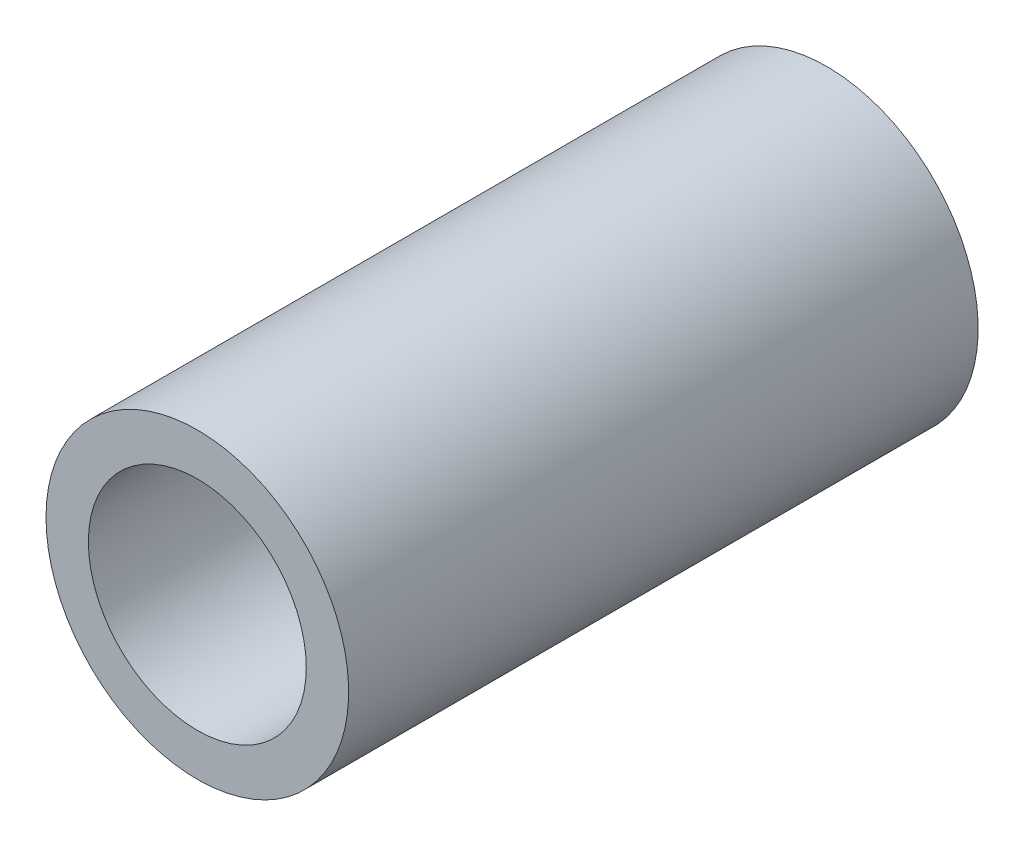
ISO-10303-21;
HEADER;
FILE_DESCRIPTION(('STEP AP214'),'2;1');
FILE_NAME('part.step','',(''),(''),'','','');
FILE_SCHEMA(('AUTOMOTIVE_DESIGN { 1 0 10303 214 1 1 1 1 }'));
ENDSEC;
DATA;
#1=APPLICATION_CONTEXT('core data for automotive mechanical design processes');
#2=APPLICATION_PROTOCOL_DEFINITION('international standard','automotive_design',2000,#1);
#3=PRODUCT_CONTEXT('',#1,'mechanical');
#4=PRODUCT('Part','Part','',(#3));
#5=PRODUCT_RELATED_PRODUCT_CATEGORY('part','',(#4));
#6=PRODUCT_DEFINITION_FORMATION('','',#4);
#7=PRODUCT_DEFINITION_CONTEXT('part definition',#1,'design');
#8=PRODUCT_DEFINITION('design','',#6,#7);
#9=PRODUCT_DEFINITION_SHAPE('','',#8);
#10=(LENGTH_UNIT() NAMED_UNIT(*) SI_UNIT(.MILLI.,.METRE.));
#11=(NAMED_UNIT(*) PLANE_ANGLE_UNIT() SI_UNIT($,.RADIAN.));
#12=(NAMED_UNIT(*) SI_UNIT($,.STERADIAN.) SOLID_ANGLE_UNIT());
#13=UNCERTAINTY_MEASURE_WITH_UNIT(LENGTH_MEASURE(1.E-05),#10,'distance_accuracy_value','');
#14=(GEOMETRIC_REPRESENTATION_CONTEXT(3) GLOBAL_UNCERTAINTY_ASSIGNED_CONTEXT((#13)) GLOBAL_UNIT_ASSIGNED_CONTEXT((#10,
#11,#12)) REPRESENTATION_CONTEXT('',''));
#15=CARTESIAN_POINT('',(0.,0.,0.));
#16=DIRECTION('',(0.,0.,1.));
#17=DIRECTION('',(1.,0.,0.));
#18=AXIS2_PLACEMENT_3D('',#15,#16,#17);
#19=CARTESIAN_POINT('',(0.,0.,26.));
#20=DIRECTION('',(0.,0.,1.));
#21=DIRECTION('',(1.,0.,0.));
#22=AXIS2_PLACEMENT_3D('',#19,#20,#21);
#23=PLANE('',#22);
#24=CARTESIAN_POINT('',(0.,0.,26.));
#25=DIRECTION('',(0.,0.,1.));
#26=DIRECTION('',(1.,0.,0.));
#27=AXIS2_PLACEMENT_3D('',#24,#25,#26);
#28=CIRCLE('',#27,12.5);
#29=CARTESIAN_POINT('',(-12.5,0.,26.));
#30=VERTEX_POINT('',#29);
#31=EDGE_CURVE('E10',#30,#30,#28,.T.);
#32=ORIENTED_EDGE('',*,*,#31,.T.);
#33=EDGE_LOOP('',(#32));
#34=FACE_BOUND('',#33,.T.);
#35=CARTESIAN_POINT('',(0.,0.,26.));
#36=DIRECTION('',(0.,0.,1.));
#37=DIRECTION('',(1.,0.,0.));
#38=AXIS2_PLACEMENT_3D('',#35,#36,#37);
#39=CIRCLE('',#38,9.);
#40=CARTESIAN_POINT('',(-9.,0.,26.));
#41=VERTEX_POINT('',#40);
#42=EDGE_CURVE('E50',#41,#41,#39,.T.);
#43=ORIENTED_EDGE('',*,*,#42,.F.);
#44=EDGE_LOOP('',(#43));
#45=FACE_BOUND('',#44,.T.);
#46=ADVANCED_FACE('F37',(#34,#45),#23,.T.);
#47=CARTESIAN_POINT('',(0.,0.,-26.));
#48=DIRECTION('',(0.,0.,1.));
#49=DIRECTION('',(1.,0.,0.));
#50=AXIS2_PLACEMENT_3D('',#47,#48,#49);
#51=PLANE('',#50);
#52=CARTESIAN_POINT('',(0.,0.,-26.));
#53=DIRECTION('',(0.,0.,1.));
#54=DIRECTION('',(1.,0.,0.));
#55=AXIS2_PLACEMENT_3D('',#52,#53,#54);
#56=CIRCLE('',#55,12.5);
#57=CARTESIAN_POINT('',(-12.5,0.,-26.));
#58=VERTEX_POINT('',#57);
#59=EDGE_CURVE('E41',#58,#58,#56,.T.);
#60=ORIENTED_EDGE('',*,*,#59,.F.);
#61=EDGE_LOOP('',(#60));
#62=FACE_BOUND('',#61,.T.);
#63=CARTESIAN_POINT('',(0.,0.,-26.));
#64=DIRECTION('',(0.,0.,1.));
#65=DIRECTION('',(1.,0.,0.));
#66=AXIS2_PLACEMENT_3D('',#63,#64,#65);
#67=CIRCLE('',#66,9.);
#68=CARTESIAN_POINT('',(-9.,0.,-26.));
#69=VERTEX_POINT('',#68);
#70=EDGE_CURVE('E52',#69,#69,#67,.T.);
#71=ORIENTED_EDGE('',*,*,#70,.T.);
#72=EDGE_LOOP('',(#71));
#73=FACE_BOUND('',#72,.T.);
#74=ADVANCED_FACE('F64',(#62,#73),#51,.F.);
#75=CARTESIAN_POINT('',(0.,0.,26.));
#76=DIRECTION('',(0.,0.,-1.));
#77=DIRECTION('',(-1.,0.,0.));
#78=AXIS2_PLACEMENT_3D('',#75,#76,#77);
#79=CYLINDRICAL_SURFACE('',#78,12.5);
#80=CARTESIAN_POINT('',(-12.5,0.,26.));
#81=CARTESIAN_POINT('',(-12.5,0.,25.4583333333333));
#82=CARTESIAN_POINT('',(-12.5,0.,24.9166666666667));
#83=CARTESIAN_POINT('',(-12.5,0.,23.8333333333333));
#84=CARTESIAN_POINT('',(-12.5,0.,23.2916666666667));
#85=CARTESIAN_POINT('',(-12.5,0.,22.2083333333333));
#86=CARTESIAN_POINT('',(-12.5,0.,21.6666666666667));
#87=CARTESIAN_POINT('',(-12.5,0.,20.5833333333333));
#88=CARTESIAN_POINT('',(-12.5,0.,20.0416666666667));
#89=CARTESIAN_POINT('',(-12.5,0.,18.9583333333333));
#90=CARTESIAN_POINT('',(-12.5,0.,18.4166666666667));
#91=CARTESIAN_POINT('',(-12.5,0.,17.3333333333333));
#92=CARTESIAN_POINT('',(-12.5,0.,16.7916666666667));
#93=CARTESIAN_POINT('',(-12.5,0.,15.7083333333333));
#94=CARTESIAN_POINT('',(-12.5,0.,15.1666666666667));
#95=CARTESIAN_POINT('',(-12.5,0.,14.0833333333333));
#96=CARTESIAN_POINT('',(-12.5,0.,13.5416666666667));
#97=CARTESIAN_POINT('',(-12.5,0.,12.4583333333333));
#98=CARTESIAN_POINT('',(-12.5,0.,11.9166666666667));
#99=CARTESIAN_POINT('',(-12.5,0.,10.8333333333333));
#100=CARTESIAN_POINT('',(-12.5,0.,10.2916666666667));
#101=CARTESIAN_POINT('',(-12.5,0.,9.20833333333333));
#102=CARTESIAN_POINT('',(-12.5,0.,8.66666666666666));
#103=CARTESIAN_POINT('',(-12.5,0.,7.58333333333333));
#104=CARTESIAN_POINT('',(-12.5,0.,7.04166666666666));
#105=CARTESIAN_POINT('',(-12.5,0.,5.95833333333333));
#106=CARTESIAN_POINT('',(-12.5,0.,5.41666666666666));
#107=CARTESIAN_POINT('',(-12.5,0.,4.33333333333333));
#108=CARTESIAN_POINT('',(-12.5,0.,3.79166666666666));
#109=CARTESIAN_POINT('',(-12.5,0.,2.70833333333333));
#110=CARTESIAN_POINT('',(-12.5,0.,2.16666666666666));
#111=CARTESIAN_POINT('',(-12.5,0.,1.08333333333333));
#112=CARTESIAN_POINT('',(-12.5,0.,0.541666666666664));
#113=CARTESIAN_POINT('',(-12.5,0.,-0.54166666666667));
#114=CARTESIAN_POINT('',(-12.5,0.,-1.08333333333334));
#115=CARTESIAN_POINT('',(-12.5,0.,-2.16666666666667));
#116=CARTESIAN_POINT('',(-12.5,0.,-2.70833333333334));
#117=CARTESIAN_POINT('',(-12.5,0.,-3.79166666666667));
#118=CARTESIAN_POINT('',(-12.5,0.,-4.33333333333334));
#119=CARTESIAN_POINT('',(-12.5,0.,-5.41666666666667));
#120=CARTESIAN_POINT('',(-12.5,0.,-5.95833333333333));
#121=CARTESIAN_POINT('',(-12.5,0.,-7.04166666666666));
#122=CARTESIAN_POINT('',(-12.5,0.,-7.58333333333333));
#123=CARTESIAN_POINT('',(-12.5,0.,-8.66666666666666));
#124=CARTESIAN_POINT('',(-12.5,0.,-9.20833333333333));
#125=CARTESIAN_POINT('',(-12.5,0.,-10.2916666666667));
#126=CARTESIAN_POINT('',(-12.5,0.,-10.8333333333333));
#127=CARTESIAN_POINT('',(-12.5,0.,-11.9166666666667));
#128=CARTESIAN_POINT('',(-12.5,0.,-12.4583333333333));
#129=CARTESIAN_POINT('',(-12.5,0.,-13.5416666666667));
#130=CARTESIAN_POINT('',(-12.5,0.,-14.0833333333333));
#131=CARTESIAN_POINT('',(-12.5,0.,-15.1666666666667));
#132=CARTESIAN_POINT('',(-12.5,0.,-15.7083333333333));
#133=CARTESIAN_POINT('',(-12.5,0.,-16.7916666666667));
#134=CARTESIAN_POINT('',(-12.5,0.,-17.3333333333333));
#135=CARTESIAN_POINT('',(-12.5,0.,-18.4166666666667));
#136=CARTESIAN_POINT('',(-12.5,0.,-18.9583333333333));
#137=CARTESIAN_POINT('',(-12.5,0.,-20.0416666666667));
#138=CARTESIAN_POINT('',(-12.5,0.,-20.5833333333333));
#139=CARTESIAN_POINT('',(-12.5,0.,-21.6666666666667));
#140=CARTESIAN_POINT('',(-12.5,0.,-22.2083333333333));
#141=CARTESIAN_POINT('',(-12.5,0.,-23.2916666666667));
#142=CARTESIAN_POINT('',(-12.5,0.,-23.8333333333333));
#143=CARTESIAN_POINT('',(-12.5,0.,-24.9166666666667));
#144=CARTESIAN_POINT('',(-12.5,0.,-25.4583333333333));
#145=CARTESIAN_POINT('',(-12.5,0.,-26.));
#146=B_SPLINE_CURVE_WITH_KNOTS('',3,(#80,#81,#82,#83,#84,#85,#86,#87,#88,#89,#90,#91,#92,#93,
#94,#95,#96,#97,#98,#99,#100,#101,#102,#103,#104,#105,#106,#107,#108,#109,#110,#111,#112,#113,
#114,#115,#116,#117,#118,#119,#120,#121,#122,#123,#124,#125,#126,#127,#128,#129,#130,#131,#132,
#133,#134,#135,#136,#137,#138,#139,#140,#141,#142,#143,#144,#145),.UNSPECIFIED.,.F.,.F.,(4,2,2,
2,2,2,2,2,2,2,2,2,2,2,2,2,2,2,2,2,2,2,2,2,2,2,2,2,2,2,2,2,4),(0.,1.625,3.25,4.875,6.5,8.125,
9.75,11.375,13.,14.625,16.25,17.875,19.5,21.125,22.75,24.375,26.,27.625,29.25,30.875,32.5,
34.125,35.75,37.375,39.,40.625,42.25,43.875,45.5,47.125,48.75,50.375,52.),.UNSPECIFIED.);
#147=EDGE_CURVE('BSEAM39',#30,#58,#146,.T.);
#148=ORIENTED_EDGE('',*,*,#31,.F.);
#149=ORIENTED_EDGE('',*,*,#59,.T.);
#150=ORIENTED_EDGE('',*,*,#147,.T.);
#151=ORIENTED_EDGE('',*,*,#147,.F.);
#152=EDGE_LOOP('',(#148,#150,#149,#151));
#153=FACE_BOUND('',#152,.T.);
#154=ADVANCED_FACE('F39',(#153),#79,.T.);
#155=CARTESIAN_POINT('',(0.,0.,26.));
#156=DIRECTION('',(0.,0.,-1.));
#157=DIRECTION('',(-1.,0.,0.));
#158=AXIS2_PLACEMENT_3D('',#155,#156,#157);
#159=CYLINDRICAL_SURFACE('',#158,9.);
#160=CARTESIAN_POINT('',(-9.,0.,26.));
#161=CARTESIAN_POINT('',(-9.,0.,25.4583333333333));
#162=CARTESIAN_POINT('',(-9.,0.,24.9166666666667));
#163=CARTESIAN_POINT('',(-9.,0.,23.8333333333333));
#164=CARTESIAN_POINT('',(-9.,0.,23.2916666666667));
#165=CARTESIAN_POINT('',(-9.,0.,22.2083333333333));
#166=CARTESIAN_POINT('',(-9.,0.,21.6666666666667));
#167=CARTESIAN_POINT('',(-9.,0.,20.5833333333333));
#168=CARTESIAN_POINT('',(-9.,0.,20.0416666666667));
#169=CARTESIAN_POINT('',(-9.,0.,18.9583333333333));
#170=CARTESIAN_POINT('',(-9.,0.,18.4166666666667));
#171=CARTESIAN_POINT('',(-9.,0.,17.3333333333333));
#172=CARTESIAN_POINT('',(-9.,0.,16.7916666666667));
#173=CARTESIAN_POINT('',(-9.,0.,15.7083333333333));
#174=CARTESIAN_POINT('',(-9.,0.,15.1666666666667));
#175=CARTESIAN_POINT('',(-9.,0.,14.0833333333333));
#176=CARTESIAN_POINT('',(-9.,0.,13.5416666666667));
#177=CARTESIAN_POINT('',(-9.,0.,12.4583333333333));
#178=CARTESIAN_POINT('',(-9.,0.,11.9166666666667));
#179=CARTESIAN_POINT('',(-9.,0.,10.8333333333333));
#180=CARTESIAN_POINT('',(-9.,0.,10.2916666666667));
#181=CARTESIAN_POINT('',(-9.,0.,9.20833333333333));
#182=CARTESIAN_POINT('',(-9.,0.,8.66666666666666));
#183=CARTESIAN_POINT('',(-9.,0.,7.58333333333333));
#184=CARTESIAN_POINT('',(-9.,0.,7.04166666666666));
#185=CARTESIAN_POINT('',(-9.,0.,5.95833333333333));
#186=CARTESIAN_POINT('',(-9.,0.,5.41666666666666));
#187=CARTESIAN_POINT('',(-9.,0.,4.33333333333333));
#188=CARTESIAN_POINT('',(-9.,0.,3.79166666666666));
#189=CARTESIAN_POINT('',(-9.,0.,2.70833333333333));
#190=CARTESIAN_POINT('',(-9.,0.,2.16666666666666));
#191=CARTESIAN_POINT('',(-9.,0.,1.08333333333333));
#192=CARTESIAN_POINT('',(-9.,0.,0.541666666666664));
#193=CARTESIAN_POINT('',(-9.,0.,-0.54166666666667));
#194=CARTESIAN_POINT('',(-9.,0.,-1.08333333333334));
#195=CARTESIAN_POINT('',(-9.,0.,-2.16666666666667));
#196=CARTESIAN_POINT('',(-9.,0.,-2.70833333333334));
#197=CARTESIAN_POINT('',(-9.,0.,-3.79166666666667));
#198=CARTESIAN_POINT('',(-9.,0.,-4.33333333333334));
#199=CARTESIAN_POINT('',(-9.,0.,-5.41666666666667));
#200=CARTESIAN_POINT('',(-9.,0.,-5.95833333333333));
#201=CARTESIAN_POINT('',(-9.,0.,-7.04166666666666));
#202=CARTESIAN_POINT('',(-9.,0.,-7.58333333333333));
#203=CARTESIAN_POINT('',(-9.,0.,-8.66666666666666));
#204=CARTESIAN_POINT('',(-9.,0.,-9.20833333333333));
#205=CARTESIAN_POINT('',(-9.,0.,-10.2916666666667));
#206=CARTESIAN_POINT('',(-9.,0.,-10.8333333333333));
#207=CARTESIAN_POINT('',(-9.,0.,-11.9166666666667));
#208=CARTESIAN_POINT('',(-9.,0.,-12.4583333333333));
#209=CARTESIAN_POINT('',(-9.,0.,-13.5416666666667));
#210=CARTESIAN_POINT('',(-9.,0.,-14.0833333333333));
#211=CARTESIAN_POINT('',(-9.,0.,-15.1666666666667));
#212=CARTESIAN_POINT('',(-9.,0.,-15.7083333333333));
#213=CARTESIAN_POINT('',(-9.,0.,-16.7916666666667));
#214=CARTESIAN_POINT('',(-9.,0.,-17.3333333333333));
#215=CARTESIAN_POINT('',(-9.,0.,-18.4166666666667));
#216=CARTESIAN_POINT('',(-9.,0.,-18.9583333333333));
#217=CARTESIAN_POINT('',(-9.,0.,-20.0416666666667));
#218=CARTESIAN_POINT('',(-9.,0.,-20.5833333333333));
#219=CARTESIAN_POINT('',(-9.,0.,-21.6666666666667));
#220=CARTESIAN_POINT('',(-9.,0.,-22.2083333333333));
#221=CARTESIAN_POINT('',(-9.,0.,-23.2916666666667));
#222=CARTESIAN_POINT('',(-9.,0.,-23.8333333333333));
#223=CARTESIAN_POINT('',(-9.,0.,-24.9166666666667));
#224=CARTESIAN_POINT('',(-9.,0.,-25.4583333333333));
#225=CARTESIAN_POINT('',(-9.,0.,-26.));
#226=B_SPLINE_CURVE_WITH_KNOTS('',3,(#160,#161,#162,#163,#164,#165,#166,#167,#168,#169,#170,
#171,#172,#173,#174,#175,#176,#177,#178,#179,#180,#181,#182,#183,#184,#185,#186,#187,#188,#189,
#190,#191,#192,#193,#194,#195,#196,#197,#198,#199,#200,#201,#202,#203,#204,#205,#206,#207,#208,
#209,#210,#211,#212,#213,#214,#215,#216,#217,#218,#219,#220,#221,#222,#223,#224,#225),
.UNSPECIFIED.,.F.,.F.,(4,2,2,2,2,2,2,2,2,2,2,2,2,2,2,2,2,2,2,2,2,2,2,2,2,2,2,2,2,2,2,2,4),(0.,
1.625,3.25,4.875,6.5,8.125,9.75,11.375,13.,14.625,16.25,17.875,19.5,21.125,22.75,24.375,26.,
27.625,29.25,30.875,32.5,34.125,35.75,37.375,39.,40.625,42.25,43.875,45.5,47.125,48.75,50.375,
52.),.UNSPECIFIED.);
#227=EDGE_CURVE('BSEAM60',#41,#69,#226,.T.);
#228=ORIENTED_EDGE('',*,*,#42,.T.);
#229=ORIENTED_EDGE('',*,*,#70,.F.);
#230=ORIENTED_EDGE('',*,*,#227,.T.);
#231=ORIENTED_EDGE('',*,*,#227,.F.);
#232=EDGE_LOOP('',(#228,#230,#229,#231));
#233=FACE_BOUND('',#232,.T.);
#234=ADVANCED_FACE('F60',(#233),#159,.F.);
#235=CLOSED_SHELL('',(#46,#74,#154,#234));
#236=MANIFOLD_SOLID_BREP('B2',#235);
#237=ADVANCED_BREP_SHAPE_REPRESENTATION('',(#18,#236),#14);
#238=SHAPE_DEFINITION_REPRESENTATION(#9,#237);
ENDSEC;
END-ISO-10303-21;
